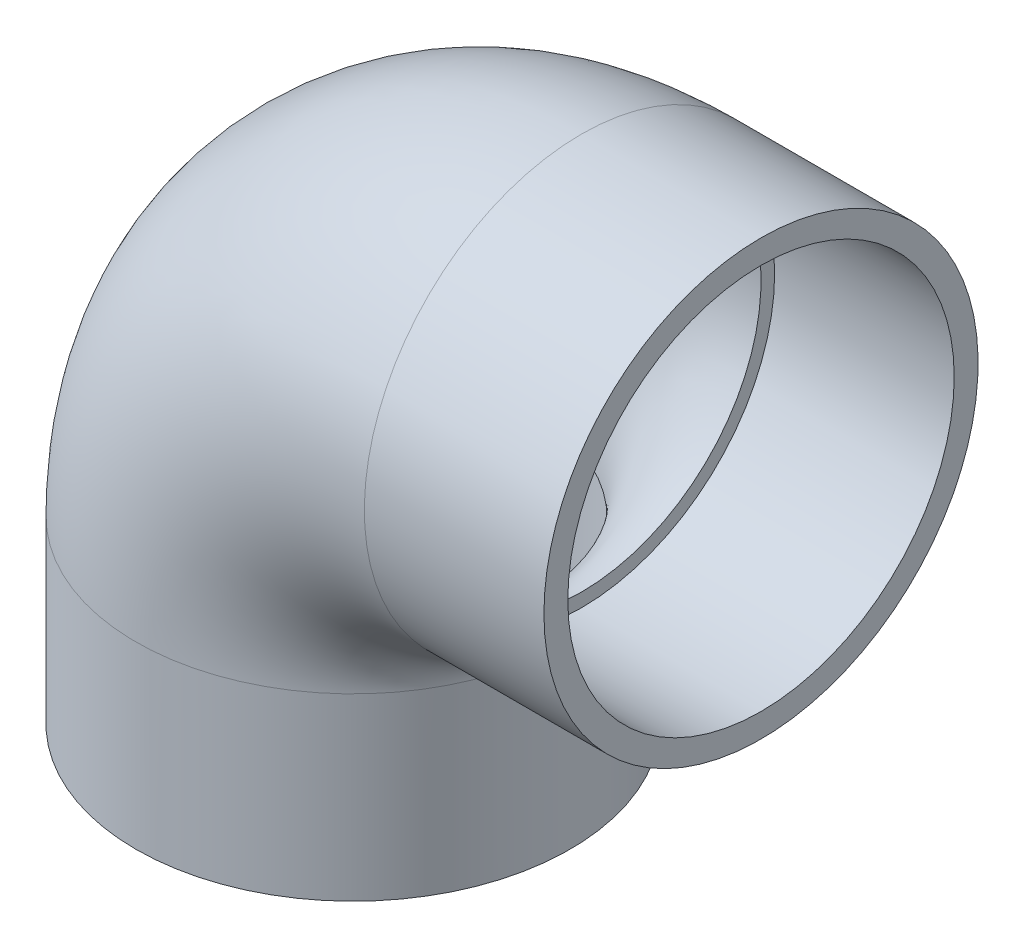
ISO-10303-21;
HEADER;
FILE_DESCRIPTION(('STEP AP214'),'2;1');
FILE_NAME('part.step','',(''),(''),'','','');
FILE_SCHEMA(('AUTOMOTIVE_DESIGN { 1 0 10303 214 1 1 1 1 }'));
ENDSEC;
DATA;
#1=APPLICATION_CONTEXT('core data for automotive mechanical design processes');
#2=APPLICATION_PROTOCOL_DEFINITION('international standard','automotive_design',2000,#1);
#3=PRODUCT_CONTEXT('',#1,'mechanical');
#4=PRODUCT('Part','Part','',(#3));
#5=PRODUCT_RELATED_PRODUCT_CATEGORY('part','',(#4));
#6=PRODUCT_DEFINITION_FORMATION('','',#4);
#7=PRODUCT_DEFINITION_CONTEXT('part definition',#1,'design');
#8=PRODUCT_DEFINITION('design','',#6,#7);
#9=PRODUCT_DEFINITION_SHAPE('','',#8);
#10=(LENGTH_UNIT() NAMED_UNIT(*) SI_UNIT(.MILLI.,.METRE.));
#11=(NAMED_UNIT(*) PLANE_ANGLE_UNIT() SI_UNIT($,.RADIAN.));
#12=(NAMED_UNIT(*) SI_UNIT($,.STERADIAN.) SOLID_ANGLE_UNIT());
#13=UNCERTAINTY_MEASURE_WITH_UNIT(LENGTH_MEASURE(1.E-05),#10,'distance_accuracy_value','');
#14=(GEOMETRIC_REPRESENTATION_CONTEXT(3) GLOBAL_UNCERTAINTY_ASSIGNED_CONTEXT((#13)) GLOBAL_UNIT_ASSIGNED_CONTEXT((#10,
#11,#12)) REPRESENTATION_CONTEXT('',''));
#15=CARTESIAN_POINT('',(0.,0.,0.));
#16=DIRECTION('',(0.,0.,1.));
#17=DIRECTION('',(1.,0.,0.));
#18=AXIS2_PLACEMENT_3D('',#15,#16,#17);
#19=CARTESIAN_POINT('',(0.,0.,0.));
#20=DIRECTION('',(0.,1.,0.));
#21=DIRECTION('',(-1.,0.,0.));
#22=AXIS2_PLACEMENT_3D('',#19,#20,#21);
#23=CYLINDRICAL_SURFACE('',#22,95.5);
#24=CARTESIAN_POINT('',(0.,79.,0.));
#25=DIRECTION('',(0.,1.,0.));
#26=DIRECTION('',(0.,0.,1.));
#27=AXIS2_PLACEMENT_3D('',#24,#25,#26);
#28=CIRCLE('',#27,95.5);
#29=CARTESIAN_POINT('',(-95.5,79.,0.));
#30=VERTEX_POINT('',#29);
#31=EDGE_CURVE('E62',#30,#30,#28,.T.);
#32=ORIENTED_EDGE('',*,*,#31,.F.);
#33=EDGE_LOOP('',(#32));
#34=FACE_BOUND('',#33,.T.);
#35=CARTESIAN_POINT('',(0.,0.,0.));
#36=DIRECTION('',(0.,1.,0.));
#37=DIRECTION('',(0.,0.,1.));
#38=AXIS2_PLACEMENT_3D('',#35,#36,#37);
#39=CIRCLE('',#38,95.5);
#40=CARTESIAN_POINT('',(0.,0.,95.5));
#41=VERTEX_POINT('',#40);
#42=EDGE_CURVE('E59',#41,#41,#39,.T.);
#43=ORIENTED_EDGE('',*,*,#42,.T.);
#44=EDGE_LOOP('',(#43));
#45=FACE_BOUND('',#44,.T.);
#46=ADVANCED_FACE('F37',(#34,#45),#23,.T.);
#47=CARTESIAN_POINT('',(100.5,79.,0.));
#48=DIRECTION('',(0.,0.,-1.));
#49=DIRECTION('',(-1.,0.,0.));
#50=AXIS2_PLACEMENT_3D('',#47,#48,#49);
#51=TOROIDAL_SURFACE('',#50,100.5,95.5);
#52=CARTESIAN_POINT('',(100.5,179.5,0.));
#53=DIRECTION('',(1.,0.,0.));
#54=DIRECTION('',(0.,0.,1.));
#55=AXIS2_PLACEMENT_3D('',#52,#53,#54);
#56=CIRCLE('',#55,95.5);
#57=CARTESIAN_POINT('',(100.5,275.,0.));
#58=VERTEX_POINT('',#57);
#59=EDGE_CURVE('E41',#58,#58,#56,.T.);
#60=CARTESIAN_POINT('',(100.5,79.,0.));
#61=DIRECTION('',(0.,0.,-1.));
#62=DIRECTION('',(-1.,0.,0.));
#63=AXIS2_PLACEMENT_3D('',#60,#61,#62);
#64=CIRCLE('',#63,196.);
#65=EDGE_CURVE('',#30,#58,#64,.T.);
#66=ORIENTED_EDGE('',*,*,#31,.T.);
#67=ORIENTED_EDGE('',*,*,#59,.F.);
#68=ORIENTED_EDGE('',*,*,#65,.T.);
#69=ORIENTED_EDGE('',*,*,#65,.F.);
#70=EDGE_LOOP('',(#66,#68,#67,#69));
#71=FACE_BOUND('',#70,.T.);
#72=ADVANCED_FACE('F107',(#71),#51,.T.);
#73=CARTESIAN_POINT('',(100.5,179.5,0.));
#74=DIRECTION('',(1.,0.,0.));
#75=DIRECTION('',(0.,1.,0.));
#76=AXIS2_PLACEMENT_3D('',#73,#74,#75);
#77=CYLINDRICAL_SURFACE('',#76,95.5);
#78=CARTESIAN_POINT('',(179.5,179.5,0.));
#79=DIRECTION('',(1.,0.,0.));
#80=DIRECTION('',(0.,0.,1.));
#81=AXIS2_PLACEMENT_3D('',#78,#79,#80);
#82=CIRCLE('',#81,95.5);
#83=CARTESIAN_POINT('',(179.5,179.5,95.5));
#84=VERTEX_POINT('',#83);
#85=EDGE_CURVE('E52',#84,#84,#82,.T.);
#86=ORIENTED_EDGE('',*,*,#85,.F.);
#87=EDGE_LOOP('',(#86));
#88=FACE_BOUND('',#87,.T.);
#89=ORIENTED_EDGE('',*,*,#59,.T.);
#90=EDGE_LOOP('',(#89));
#91=FACE_BOUND('',#90,.T.);
#92=ADVANCED_FACE('F39',(#88,#91),#77,.T.);
#93=CARTESIAN_POINT('',(0.,0.,0.));
#94=DIRECTION('',(0.,1.,0.));
#95=DIRECTION('',(0.,0.,1.));
#96=AXIS2_PLACEMENT_3D('',#93,#94,#95);
#97=PLANE('',#96);
#98=CARTESIAN_POINT('',(0.,0.,0.));
#99=DIRECTION('',(0.,-1.,0.));
#100=DIRECTION('',(0.,0.,-1.));
#101=AXIS2_PLACEMENT_3D('',#98,#99,#100);
#102=CIRCLE('',#101,85.);
#103=CARTESIAN_POINT('',(0.,0.,-85.));
#104=VERTEX_POINT('',#103);
#105=EDGE_CURVE('E72',#104,#104,#102,.T.);
#106=ORIENTED_EDGE('',*,*,#105,.F.);
#107=EDGE_LOOP('',(#106));
#108=FACE_BOUND('',#107,.T.);
#109=ORIENTED_EDGE('',*,*,#42,.F.);
#110=EDGE_LOOP('',(#109));
#111=FACE_BOUND('',#110,.T.);
#112=ADVANCED_FACE('F101',(#108,#111),#97,.F.);
#113=CARTESIAN_POINT('',(179.5,179.5,0.));
#114=DIRECTION('',(1.,0.,0.));
#115=DIRECTION('',(0.,0.,1.));
#116=AXIS2_PLACEMENT_3D('',#113,#114,#115);
#117=PLANE('',#116);
#118=CARTESIAN_POINT('',(179.5,179.5,0.));
#119=DIRECTION('',(1.,0.,0.));
#120=DIRECTION('',(0.,1.,0.));
#121=AXIS2_PLACEMENT_3D('',#118,#119,#120);
#122=CIRCLE('',#121,85.);
#123=CARTESIAN_POINT('',(179.5,264.5,0.));
#124=VERTEX_POINT('',#123);
#125=EDGE_CURVE('E80',#124,#124,#122,.T.);
#126=ORIENTED_EDGE('',*,*,#125,.F.);
#127=EDGE_LOOP('',(#126));
#128=FACE_BOUND('',#127,.T.);
#129=ORIENTED_EDGE('',*,*,#85,.T.);
#130=EDGE_LOOP('',(#129));
#131=FACE_BOUND('',#130,.T.);
#132=ADVANCED_FACE('F97',(#128,#131),#117,.T.);
#133=CARTESIAN_POINT('',(100.5,79.,0.));
#134=DIRECTION('',(0.,0.,-1.));
#135=DIRECTION('',(-1.,0.,0.));
#136=AXIS2_PLACEMENT_3D('',#133,#134,#135);
#137=TOROIDAL_SURFACE('',#136,100.5,79.);
#138=CARTESIAN_POINT('',(0.,79.,0.));
#139=DIRECTION('',(0.,1.,0.));
#140=DIRECTION('',(0.,0.,1.));
#141=AXIS2_PLACEMENT_3D('',#138,#139,#140);
#142=CIRCLE('',#141,79.);
#143=CARTESIAN_POINT('',(-79.,79.,0.));
#144=VERTEX_POINT('',#143);
#145=EDGE_CURVE('E46',#144,#144,#142,.F.);
#146=CARTESIAN_POINT('',(100.5,179.5,0.));
#147=DIRECTION('',(1.,0.,0.));
#148=DIRECTION('',(0.,0.,1.));
#149=AXIS2_PLACEMENT_3D('',#146,#147,#148);
#150=CIRCLE('',#149,79.);
#151=CARTESIAN_POINT('',(100.5,258.5,0.));
#152=VERTEX_POINT('',#151);
#153=EDGE_CURVE('E10',#152,#152,#150,.F.);
#154=CARTESIAN_POINT('',(100.5,79.,0.));
#155=DIRECTION('',(0.,0.,-1.));
#156=DIRECTION('',(-1.,0.,0.));
#157=AXIS2_PLACEMENT_3D('',#154,#155,#156);
#158=CIRCLE('',#157,179.5);
#159=EDGE_CURVE('',#144,#152,#158,.T.);
#160=ORIENTED_EDGE('',*,*,#145,.T.);
#161=ORIENTED_EDGE('',*,*,#153,.F.);
#162=ORIENTED_EDGE('',*,*,#159,.T.);
#163=ORIENTED_EDGE('',*,*,#159,.F.);
#164=EDGE_LOOP('',(#160,#162,#161,#163));
#165=FACE_BOUND('',#164,.T.);
#166=ADVANCED_FACE('F100',(#165),#137,.F.);
#167=CARTESIAN_POINT('',(0.,79.,0.));
#168=DIRECTION('',(0.,-1.,0.));
#169=DIRECTION('',(0.,0.,-1.));
#170=AXIS2_PLACEMENT_3D('',#167,#168,#169);
#171=CYLINDRICAL_SURFACE('',#170,85.);
#172=CARTESIAN_POINT('',(0.,79.,0.));
#173=DIRECTION('',(0.,-1.,0.));
#174=DIRECTION('',(0.,0.,-1.));
#175=AXIS2_PLACEMENT_3D('',#172,#173,#174);
#176=CIRCLE('',#175,85.);
#177=CARTESIAN_POINT('',(0.,79.,-85.));
#178=VERTEX_POINT('',#177);
#179=EDGE_CURVE('E65',#178,#178,#176,.T.);
#180=ORIENTED_EDGE('',*,*,#179,.F.);
#181=EDGE_LOOP('',(#180));
#182=FACE_BOUND('',#181,.T.);
#183=ORIENTED_EDGE('',*,*,#105,.T.);
#184=EDGE_LOOP('',(#183));
#185=FACE_BOUND('',#184,.T.);
#186=ADVANCED_FACE('F116',(#182,#185),#171,.F.);
#187=CARTESIAN_POINT('',(0.,79.,0.));
#188=DIRECTION('',(0.,-1.,0.));
#189=DIRECTION('',(0.,0.,-1.));
#190=AXIS2_PLACEMENT_3D('',#187,#188,#189);
#191=PLANE('',#190);
#192=ORIENTED_EDGE('',*,*,#145,.F.);
#193=EDGE_LOOP('',(#192));
#194=FACE_BOUND('',#193,.T.);
#195=ORIENTED_EDGE('',*,*,#179,.T.);
#196=EDGE_LOOP('',(#195));
#197=FACE_BOUND('',#196,.T.);
#198=ADVANCED_FACE('F93',(#194,#197),#191,.T.);
#199=CARTESIAN_POINT('',(100.5,179.5,0.));
#200=DIRECTION('',(1.,0.,0.));
#201=DIRECTION('',(0.,1.,0.));
#202=AXIS2_PLACEMENT_3D('',#199,#200,#201);
#203=CYLINDRICAL_SURFACE('',#202,85.);
#204=CARTESIAN_POINT('',(100.5,179.5,0.));
#205=DIRECTION('',(1.,0.,0.));
#206=DIRECTION('',(0.,1.,0.));
#207=AXIS2_PLACEMENT_3D('',#204,#205,#206);
#208=CIRCLE('',#207,85.);
#209=CARTESIAN_POINT('',(100.5,264.5,0.));
#210=VERTEX_POINT('',#209);
#211=EDGE_CURVE('E78',#210,#210,#208,.T.);
#212=ORIENTED_EDGE('',*,*,#211,.F.);
#213=EDGE_LOOP('',(#212));
#214=FACE_BOUND('',#213,.T.);
#215=ORIENTED_EDGE('',*,*,#125,.T.);
#216=EDGE_LOOP('',(#215));
#217=FACE_BOUND('',#216,.T.);
#218=ADVANCED_FACE('F90',(#214,#217),#203,.F.);
#219=CARTESIAN_POINT('',(100.5,179.5,0.));
#220=DIRECTION('',(1.,0.,0.));
#221=DIRECTION('',(0.,1.,0.));
#222=AXIS2_PLACEMENT_3D('',#219,#220,#221);
#223=PLANE('',#222);
#224=ORIENTED_EDGE('',*,*,#153,.T.);
#225=EDGE_LOOP('',(#224));
#226=FACE_BOUND('',#225,.T.);
#227=ORIENTED_EDGE('',*,*,#211,.T.);
#228=EDGE_LOOP('',(#227));
#229=FACE_BOUND('',#228,.T.);
#230=ADVANCED_FACE('F88',(#226,#229),#223,.T.);
#231=CLOSED_SHELL('',(#46,#72,#92,#112,#132,#166,#186,#198,#218,#230));
#232=MANIFOLD_SOLID_BREP('B2',#231);
#233=ADVANCED_BREP_SHAPE_REPRESENTATION('',(#18,#232),#14);
#234=SHAPE_DEFINITION_REPRESENTATION(#9,#233);
ENDSEC;
END-ISO-10303-21;
